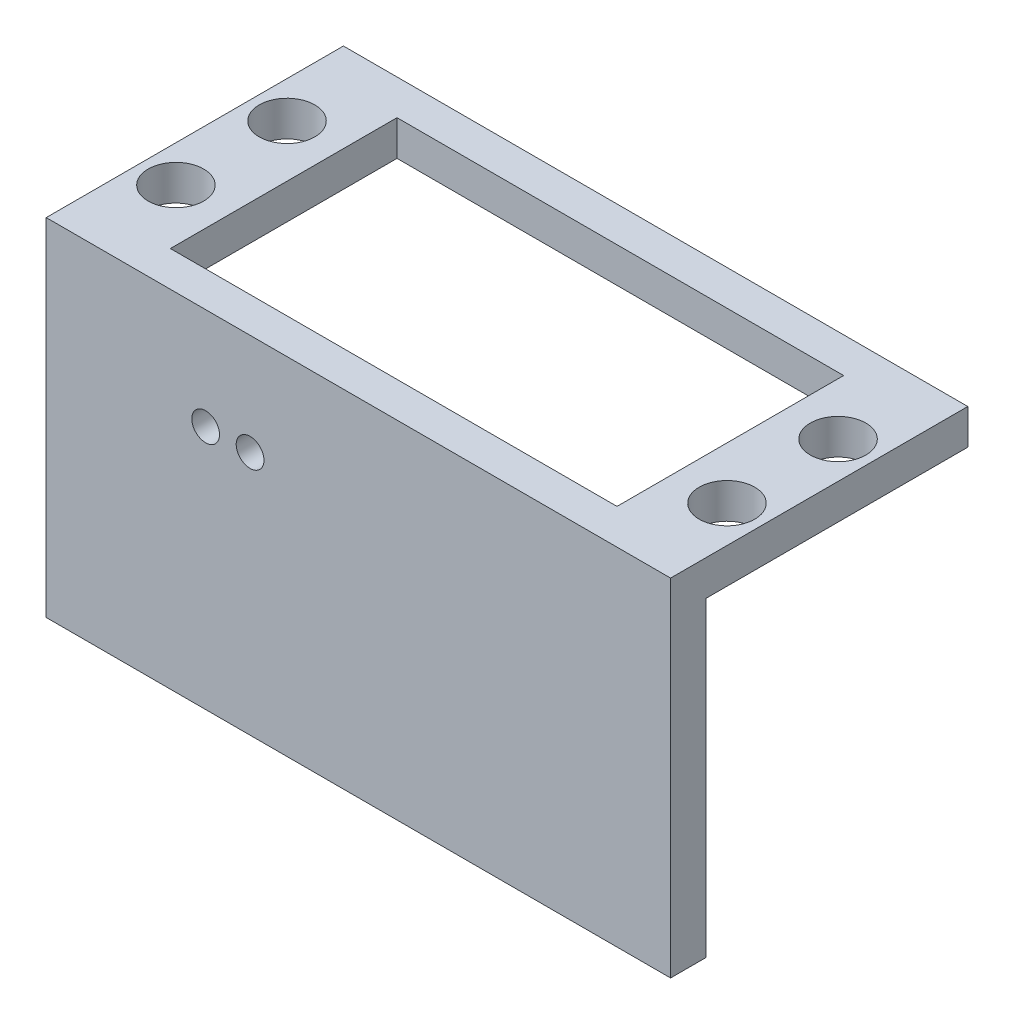
ISO-10303-21;
HEADER;
FILE_DESCRIPTION(('STEP AP214'),'2;1');
FILE_NAME('part.step','',(''),(''),'','','');
FILE_SCHEMA(('AUTOMOTIVE_DESIGN { 1 0 10303 214 1 1 1 1 }'));
ENDSEC;
DATA;
#1=APPLICATION_CONTEXT('core data for automotive mechanical design processes');
#2=APPLICATION_PROTOCOL_DEFINITION('international standard','automotive_design',2000,#1);
#3=PRODUCT_CONTEXT('',#1,'mechanical');
#4=PRODUCT('Part','Part','',(#3));
#5=PRODUCT_RELATED_PRODUCT_CATEGORY('part','',(#4));
#6=PRODUCT_DEFINITION_FORMATION('','',#4);
#7=PRODUCT_DEFINITION_CONTEXT('part definition',#1,'design');
#8=PRODUCT_DEFINITION('design','',#6,#7);
#9=PRODUCT_DEFINITION_SHAPE('','',#8);
#10=(LENGTH_UNIT() NAMED_UNIT(*) SI_UNIT(.MILLI.,.METRE.));
#11=(NAMED_UNIT(*) PLANE_ANGLE_UNIT() SI_UNIT($,.RADIAN.));
#12=(NAMED_UNIT(*) SI_UNIT($,.STERADIAN.) SOLID_ANGLE_UNIT());
#13=UNCERTAINTY_MEASURE_WITH_UNIT(LENGTH_MEASURE(1.E-05),#10,'distance_accuracy_value','');
#14=(GEOMETRIC_REPRESENTATION_CONTEXT(3) GLOBAL_UNCERTAINTY_ASSIGNED_CONTEXT((#13)) GLOBAL_UNIT_ASSIGNED_CONTEXT((#10,
#11,#12)) REPRESENTATION_CONTEXT('',''));
#15=CARTESIAN_POINT('',(0.,0.,0.));
#16=DIRECTION('',(0.,0.,1.));
#17=DIRECTION('',(1.,0.,0.));
#18=AXIS2_PLACEMENT_3D('',#15,#16,#17);
#19=CARTESIAN_POINT('',(0.,0.,0.));
#20=DIRECTION('',(0.,1.,0.));
#21=DIRECTION('',(0.,0.,1.));
#22=AXIS2_PLACEMENT_3D('',#19,#20,#21);
#23=PLANE('',#22);
#24=CARTESIAN_POINT('',(-24.8,0.,-4.99999999999998));
#25=DIRECTION('',(0.,1.,0.));
#26=DIRECTION('',(0.,0.,-1.));
#27=AXIS2_PLACEMENT_3D('',#24,#25,#26);
#28=CIRCLE('',#27,2.5);
#29=CARTESIAN_POINT('',(-24.8,0.,-7.49999999999998));
#30=VERTEX_POINT('',#29);
#31=EDGE_CURVE('E151',#30,#30,#28,.T.);
#32=ORIENTED_EDGE('',*,*,#31,.T.);
#33=EDGE_LOOP('',(#32));
#34=FACE_BOUND('',#33,.T.);
#35=CARTESIAN_POINT('',(-24.8,0.,5.00000000000002));
#36=DIRECTION('',(0.,1.,0.));
#37=DIRECTION('',(0.,0.,-1.));
#38=AXIS2_PLACEMENT_3D('',#35,#36,#37);
#39=CIRCLE('',#38,2.5);
#40=CARTESIAN_POINT('',(-24.8,0.,2.50000000000002));
#41=VERTEX_POINT('',#40);
#42=EDGE_CURVE('E155',#41,#41,#39,.T.);
#43=ORIENTED_EDGE('',*,*,#42,.T.);
#44=EDGE_LOOP('',(#43));
#45=FACE_BOUND('',#44,.T.);
#46=CARTESIAN_POINT('',(24.8,0.,5.00000000000001));
#47=DIRECTION('',(0.,1.,0.));
#48=DIRECTION('',(0.,0.,1.));
#49=AXIS2_PLACEMENT_3D('',#46,#47,#48);
#50=CIRCLE('',#49,2.5);
#51=CARTESIAN_POINT('',(24.8,0.,7.50000000000001));
#52=VERTEX_POINT('',#51);
#53=EDGE_CURVE('E161',#52,#52,#50,.T.);
#54=ORIENTED_EDGE('',*,*,#53,.T.);
#55=EDGE_LOOP('',(#54));
#56=FACE_BOUND('',#55,.T.);
#57=CARTESIAN_POINT('',(24.8,0.,-4.99999999999999));
#58=DIRECTION('',(0.,1.,0.));
#59=DIRECTION('',(0.,0.,1.));
#60=AXIS2_PLACEMENT_3D('',#57,#58,#59);
#61=CIRCLE('',#60,2.5);
#62=CARTESIAN_POINT('',(24.8,0.,-2.5));
#63=VERTEX_POINT('',#62);
#64=EDGE_CURVE('E167',#63,#63,#61,.T.);
#65=ORIENTED_EDGE('',*,*,#64,.T.);
#66=EDGE_LOOP('',(#65));
#67=FACE_BOUND('',#66,.T.);
#68=DIRECTION('',(1.,0.,0.));
#69=VECTOR('',#68,1.);
#70=CARTESIAN_POINT('',(28.1,0.,10.2));
#71=LINE('',#70,#69);
#72=CARTESIAN_POINT('',(-28.1,0.,10.2));
#73=VERTEX_POINT('',#72);
#74=CARTESIAN_POINT('',(-20.1,0.,10.2));
#75=VERTEX_POINT('',#74);
#76=EDGE_CURVE('E43',#73,#75,#71,.T.);
#77=ORIENTED_EDGE('',*,*,#76,.F.);
#78=DIRECTION('',(0.,0.,1.));
#79=VECTOR('',#78,1.);
#80=CARTESIAN_POINT('',(-28.1,0.,-13.375));
#81=LINE('',#80,#79);
#82=CARTESIAN_POINT('',(-28.1,0.,-13.375));
#83=VERTEX_POINT('',#82);
#84=EDGE_CURVE('E203',#83,#73,#81,.T.);
#85=ORIENTED_EDGE('',*,*,#84,.F.);
#86=DIRECTION('',(-1.,0.,0.));
#87=VECTOR('',#86,1.);
#88=CARTESIAN_POINT('',(-28.1,0.,-13.375));
#89=LINE('',#88,#87);
#90=CARTESIAN_POINT('',(28.1,0.,-13.375));
#91=VERTEX_POINT('',#90);
#92=EDGE_CURVE('E209',#91,#83,#89,.T.);
#93=ORIENTED_EDGE('',*,*,#92,.F.);
#94=DIRECTION('',(0.,0.,-1.));
#95=VECTOR('',#94,1.);
#96=CARTESIAN_POINT('',(28.1,0.,-13.375));
#97=LINE('',#96,#95);
#98=CARTESIAN_POINT('',(28.1,0.,10.2));
#99=VERTEX_POINT('',#98);
#100=EDGE_CURVE('E200',#99,#91,#97,.T.);
#101=ORIENTED_EDGE('',*,*,#100,.F.);
#102=CARTESIAN_POINT('',(20.1,0.,10.2));
#103=VERTEX_POINT('',#102);
#104=EDGE_CURVE('E11',#103,#99,#71,.T.);
#105=ORIENTED_EDGE('',*,*,#104,.F.);
#106=DIRECTION('',(0.,0.,-1.));
#107=VECTOR('',#106,1.);
#108=CARTESIAN_POINT('',(20.1,0.,-10.2));
#109=LINE('',#108,#107);
#110=CARTESIAN_POINT('',(20.1,0.,-10.2));
#111=VERTEX_POINT('',#110);
#112=EDGE_CURVE('E173',#103,#111,#109,.T.);
#113=ORIENTED_EDGE('',*,*,#112,.T.);
#114=DIRECTION('',(-1.,0.,0.));
#115=VECTOR('',#114,1.);
#116=CARTESIAN_POINT('',(-20.1,0.,-10.2));
#117=LINE('',#116,#115);
#118=CARTESIAN_POINT('',(-20.1,0.,-10.2));
#119=VERTEX_POINT('',#118);
#120=EDGE_CURVE('E188',#111,#119,#117,.T.);
#121=ORIENTED_EDGE('',*,*,#120,.T.);
#122=DIRECTION('',(0.,0.,1.));
#123=VECTOR('',#122,1.);
#124=CARTESIAN_POINT('',(-20.1,0.,-10.2));
#125=LINE('',#124,#123);
#126=EDGE_CURVE('E179',#119,#75,#125,.T.);
#127=ORIENTED_EDGE('',*,*,#126,.T.);
#128=EDGE_LOOP('',(#77,#85,#93,#101,#105,#113,#121,#127));
#129=FACE_BOUND('',#128,.T.);
#130=ADVANCED_FACE('F33',(#34,#45,#56,#67,#129),#23,.F.);
#131=CARTESIAN_POINT('',(0.,3.175,0.));
#132=DIRECTION('',(0.,1.,0.));
#133=DIRECTION('',(0.,0.,1.));
#134=AXIS2_PLACEMENT_3D('',#131,#132,#133);
#135=PLANE('',#134);
#136=CARTESIAN_POINT('',(-24.8,3.175,5.00000000000002));
#137=DIRECTION('',(0.,1.,0.));
#138=DIRECTION('',(0.,0.,-1.));
#139=AXIS2_PLACEMENT_3D('',#136,#137,#138);
#140=CIRCLE('',#139,2.5);
#141=CARTESIAN_POINT('',(-24.8,3.175,2.50000000000002));
#142=VERTEX_POINT('',#141);
#143=EDGE_CURVE('E158',#142,#142,#140,.T.);
#144=ORIENTED_EDGE('',*,*,#143,.F.);
#145=EDGE_LOOP('',(#144));
#146=FACE_BOUND('',#145,.T.);
#147=CARTESIAN_POINT('',(24.8,3.175,-4.99999999999999));
#148=DIRECTION('',(0.,1.,0.));
#149=DIRECTION('',(0.,0.,1.));
#150=AXIS2_PLACEMENT_3D('',#147,#148,#149);
#151=CIRCLE('',#150,2.5);
#152=CARTESIAN_POINT('',(24.8,3.175,-2.5));
#153=VERTEX_POINT('',#152);
#154=EDGE_CURVE('E170',#153,#153,#151,.T.);
#155=ORIENTED_EDGE('',*,*,#154,.F.);
#156=EDGE_LOOP('',(#155));
#157=FACE_BOUND('',#156,.T.);
#158=DIRECTION('',(0.,0.,-1.));
#159=VECTOR('',#158,1.);
#160=CARTESIAN_POINT('',(28.1,3.175,-13.375));
#161=LINE('',#160,#159);
#162=CARTESIAN_POINT('',(28.1,3.175,13.375));
#163=VERTEX_POINT('',#162);
#164=CARTESIAN_POINT('',(28.1,3.175,-13.375));
#165=VERTEX_POINT('',#164);
#166=EDGE_CURVE('E120',#163,#165,#161,.T.);
#167=ORIENTED_EDGE('',*,*,#166,.T.);
#168=DIRECTION('',(-1.,0.,0.));
#169=VECTOR('',#168,1.);
#170=CARTESIAN_POINT('',(-28.1,3.175,-13.375));
#171=LINE('',#170,#169);
#172=CARTESIAN_POINT('',(-28.1,3.175,-13.375));
#173=VERTEX_POINT('',#172);
#174=EDGE_CURVE('E202',#165,#173,#171,.T.);
#175=ORIENTED_EDGE('',*,*,#174,.T.);
#176=DIRECTION('',(0.,0.,1.));
#177=VECTOR('',#176,1.);
#178=CARTESIAN_POINT('',(-28.1,3.175,-13.375));
#179=LINE('',#178,#177);
#180=CARTESIAN_POINT('',(-28.1,3.175,13.375));
#181=VERTEX_POINT('',#180);
#182=EDGE_CURVE('E205',#173,#181,#179,.T.);
#183=ORIENTED_EDGE('',*,*,#182,.T.);
#184=DIRECTION('',(1.,0.,0.));
#185=VECTOR('',#184,1.);
#186=CARTESIAN_POINT('',(-28.1,3.175,13.375));
#187=LINE('',#186,#185);
#188=EDGE_CURVE('E124',#181,#163,#187,.T.);
#189=ORIENTED_EDGE('',*,*,#188,.T.);
#190=EDGE_LOOP('',(#167,#175,#183,#189));
#191=FACE_BOUND('',#190,.T.);
#192=DIRECTION('',(-1.,0.,0.));
#193=VECTOR('',#192,1.);
#194=CARTESIAN_POINT('',(-20.1,3.175,-10.2));
#195=LINE('',#194,#193);
#196=CARTESIAN_POINT('',(20.1,3.175,-10.2));
#197=VERTEX_POINT('',#196);
#198=CARTESIAN_POINT('',(-20.1,3.175,-10.2));
#199=VERTEX_POINT('',#198);
#200=EDGE_CURVE('E178',#197,#199,#195,.T.);
#201=ORIENTED_EDGE('',*,*,#200,.F.);
#202=DIRECTION('',(0.,0.,-1.));
#203=VECTOR('',#202,1.);
#204=CARTESIAN_POINT('',(20.1,3.175,-10.2));
#205=LINE('',#204,#203);
#206=CARTESIAN_POINT('',(20.1,3.175,10.2));
#207=VERTEX_POINT('',#206);
#208=EDGE_CURVE('E176',#207,#197,#205,.T.);
#209=ORIENTED_EDGE('',*,*,#208,.F.);
#210=DIRECTION('',(1.,0.,0.));
#211=VECTOR('',#210,1.);
#212=CARTESIAN_POINT('',(-20.1,3.175,10.2));
#213=LINE('',#212,#211);
#214=CARTESIAN_POINT('',(-20.1,3.175,10.2));
#215=VERTEX_POINT('',#214);
#216=EDGE_CURVE('E183',#215,#207,#213,.T.);
#217=ORIENTED_EDGE('',*,*,#216,.F.);
#218=DIRECTION('',(0.,0.,1.));
#219=VECTOR('',#218,1.);
#220=CARTESIAN_POINT('',(-20.1,3.175,-10.2));
#221=LINE('',#220,#219);
#222=EDGE_CURVE('E181',#199,#215,#221,.T.);
#223=ORIENTED_EDGE('',*,*,#222,.F.);
#224=EDGE_LOOP('',(#201,#209,#217,#223));
#225=FACE_BOUND('',#224,.T.);
#226=CARTESIAN_POINT('',(24.8,3.175,5.00000000000001));
#227=DIRECTION('',(0.,1.,0.));
#228=DIRECTION('',(0.,0.,1.));
#229=AXIS2_PLACEMENT_3D('',#226,#227,#228);
#230=CIRCLE('',#229,2.5);
#231=CARTESIAN_POINT('',(24.8,3.175,7.50000000000001));
#232=VERTEX_POINT('',#231);
#233=EDGE_CURVE('E164',#232,#232,#230,.T.);
#234=ORIENTED_EDGE('',*,*,#233,.F.);
#235=EDGE_LOOP('',(#234));
#236=FACE_BOUND('',#235,.T.);
#237=CARTESIAN_POINT('',(-24.8,3.175,-4.99999999999998));
#238=DIRECTION('',(0.,1.,0.));
#239=DIRECTION('',(0.,0.,-1.));
#240=AXIS2_PLACEMENT_3D('',#237,#238,#239);
#241=CIRCLE('',#240,2.5);
#242=CARTESIAN_POINT('',(-24.8,3.175,-7.49999999999998));
#243=VERTEX_POINT('',#242);
#244=EDGE_CURVE('E152',#243,#243,#241,.T.);
#245=ORIENTED_EDGE('',*,*,#244,.F.);
#246=EDGE_LOOP('',(#245));
#247=FACE_BOUND('',#246,.T.);
#248=ADVANCED_FACE('F236',(#146,#157,#191,#225,#236,#247),#135,.T.);
#249=CARTESIAN_POINT('',(28.1,3.175,-13.375));
#250=DIRECTION('',(-1.,0.,0.));
#251=DIRECTION('',(0.,0.,1.));
#252=AXIS2_PLACEMENT_3D('',#249,#250,#251);
#253=PLANE('',#252);
#254=DIRECTION('',(0.,-1.,0.));
#255=VECTOR('',#254,1.);
#256=CARTESIAN_POINT('',(28.1,3.175,13.375));
#257=LINE('',#256,#255);
#258=CARTESIAN_POINT('',(28.1,-28.,13.375));
#259=VERTEX_POINT('',#258);
#260=EDGE_CURVE('E113',#163,#259,#257,.T.);
#261=ORIENTED_EDGE('',*,*,#260,.T.);
#262=DIRECTION('',(0.,0.,1.));
#263=VECTOR('',#262,1.);
#264=CARTESIAN_POINT('',(28.1,-28.,13.375));
#265=LINE('',#264,#263);
#266=CARTESIAN_POINT('',(28.1,-28.,10.2));
#267=VERTEX_POINT('',#266);
#268=EDGE_CURVE('E117',#267,#259,#265,.T.);
#269=ORIENTED_EDGE('',*,*,#268,.F.);
#270=DIRECTION('',(0.,1.,0.));
#271=VECTOR('',#270,1.);
#272=CARTESIAN_POINT('',(28.1,-28.,10.2));
#273=LINE('',#272,#271);
#274=EDGE_CURVE('E145',#267,#99,#273,.T.);
#275=ORIENTED_EDGE('',*,*,#274,.T.);
#276=ORIENTED_EDGE('',*,*,#100,.T.);
#277=DIRECTION('',(0.,-1.,0.));
#278=VECTOR('',#277,1.);
#279=CARTESIAN_POINT('',(28.1,3.175,-13.375));
#280=LINE('',#279,#278);
#281=EDGE_CURVE('E37',#165,#91,#280,.T.);
#282=ORIENTED_EDGE('',*,*,#281,.F.);
#283=ORIENTED_EDGE('',*,*,#166,.F.);
#284=EDGE_LOOP('',(#261,#269,#275,#276,#282,#283));
#285=FACE_BOUND('',#284,.T.);
#286=ADVANCED_FACE('F35',(#285),#253,.F.);
#287=CARTESIAN_POINT('',(-28.1,3.175,-13.375));
#288=DIRECTION('',(0.,0.,1.));
#289=DIRECTION('',(1.,0.,0.));
#290=AXIS2_PLACEMENT_3D('',#287,#288,#289);
#291=PLANE('',#290);
#292=ORIENTED_EDGE('',*,*,#92,.T.);
#293=DIRECTION('',(0.,-1.,0.));
#294=VECTOR('',#293,1.);
#295=CARTESIAN_POINT('',(-28.1,3.175,-13.375));
#296=LINE('',#295,#294);
#297=EDGE_CURVE('E212',#173,#83,#296,.T.);
#298=ORIENTED_EDGE('',*,*,#297,.F.);
#299=ORIENTED_EDGE('',*,*,#174,.F.);
#300=ORIENTED_EDGE('',*,*,#281,.T.);
#301=EDGE_LOOP('',(#292,#298,#299,#300));
#302=FACE_BOUND('',#301,.T.);
#303=ADVANCED_FACE('F219',(#302),#291,.F.);
#304=CARTESIAN_POINT('',(-28.1,3.175,-13.375));
#305=DIRECTION('',(1.,0.,0.));
#306=DIRECTION('',(0.,0.,-1.));
#307=AXIS2_PLACEMENT_3D('',#304,#305,#306);
#308=PLANE('',#307);
#309=ORIENTED_EDGE('',*,*,#84,.T.);
#310=DIRECTION('',(0.,1.,0.));
#311=VECTOR('',#310,1.);
#312=CARTESIAN_POINT('',(-28.1,-28.,10.2));
#313=LINE('',#312,#311);
#314=CARTESIAN_POINT('',(-28.1,-28.,10.2));
#315=VERTEX_POINT('',#314);
#316=EDGE_CURVE('E148',#315,#73,#313,.T.);
#317=ORIENTED_EDGE('',*,*,#316,.F.);
#318=DIRECTION('',(0.,0.,-1.));
#319=VECTOR('',#318,1.);
#320=CARTESIAN_POINT('',(-28.1,-28.,13.375));
#321=LINE('',#320,#319);
#322=CARTESIAN_POINT('',(-28.1,-28.,13.375));
#323=VERTEX_POINT('',#322);
#324=EDGE_CURVE('E132',#323,#315,#321,.T.);
#325=ORIENTED_EDGE('',*,*,#324,.F.);
#326=DIRECTION('',(0.,-1.,0.));
#327=VECTOR('',#326,1.);
#328=CARTESIAN_POINT('',(-28.1,3.175,13.375));
#329=LINE('',#328,#327);
#330=EDGE_CURVE('E123',#181,#323,#329,.T.);
#331=ORIENTED_EDGE('',*,*,#330,.F.);
#332=ORIENTED_EDGE('',*,*,#182,.F.);
#333=ORIENTED_EDGE('',*,*,#297,.T.);
#334=EDGE_LOOP('',(#309,#317,#325,#331,#332,#333));
#335=FACE_BOUND('',#334,.T.);
#336=ADVANCED_FACE('F222',(#335),#308,.F.);
#337=CARTESIAN_POINT('',(-28.1,3.175,13.375));
#338=DIRECTION('',(0.,0.,-1.));
#339=DIRECTION('',(-1.,0.,0.));
#340=AXIS2_PLACEMENT_3D('',#337,#338,#339);
#341=PLANE('',#340);
#342=CARTESIAN_POINT('',(-9.75,-5.95332929377434,13.375));
#343=DIRECTION('',(0.,0.,1.));
#344=DIRECTION('',(1.,0.,0.));
#345=AXIS2_PLACEMENT_3D('',#342,#343,#344);
#346=CIRCLE('',#345,1.25);
#347=CARTESIAN_POINT('',(-8.5,-5.95332929377434,13.375));
#348=VERTEX_POINT('',#347);
#349=EDGE_CURVE('E398',#348,#348,#346,.T.);
#350=ORIENTED_EDGE('',*,*,#349,.F.);
#351=EDGE_LOOP('',(#350));
#352=FACE_BOUND('',#351,.T.);
#353=CARTESIAN_POINT('',(-13.75,-5.95332929377435,13.375));
#354=DIRECTION('',(0.,0.,1.));
#355=DIRECTION('',(1.,0.,0.));
#356=AXIS2_PLACEMENT_3D('',#353,#354,#355);
#357=CIRCLE('',#356,1.25);
#358=CARTESIAN_POINT('',(-12.5,-5.95332929377435,13.375));
#359=VERTEX_POINT('',#358);
#360=EDGE_CURVE('E403',#359,#359,#357,.T.);
#361=ORIENTED_EDGE('',*,*,#360,.F.);
#362=EDGE_LOOP('',(#361));
#363=FACE_BOUND('',#362,.T.);
#364=ORIENTED_EDGE('',*,*,#330,.T.);
#365=DIRECTION('',(-1.,0.,0.));
#366=VECTOR('',#365,1.);
#367=CARTESIAN_POINT('',(28.1,-28.,13.375));
#368=LINE('',#367,#366);
#369=EDGE_CURVE('E127',#259,#323,#368,.T.);
#370=ORIENTED_EDGE('',*,*,#369,.F.);
#371=ORIENTED_EDGE('',*,*,#260,.F.);
#372=ORIENTED_EDGE('',*,*,#188,.F.);
#373=EDGE_LOOP('',(#364,#370,#371,#372));
#374=FACE_BOUND('',#373,.T.);
#375=ADVANCED_FACE('F128',(#352,#363,#374),#341,.F.);
#376=CARTESIAN_POINT('',(20.1,3.175,-10.2));
#377=DIRECTION('',(-1.,0.,0.));
#378=DIRECTION('',(0.,0.,1.));
#379=AXIS2_PLACEMENT_3D('',#376,#377,#378);
#380=PLANE('',#379);
#381=ORIENTED_EDGE('',*,*,#112,.F.);
#382=DIRECTION('',(0.,-1.,0.));
#383=VECTOR('',#382,1.);
#384=CARTESIAN_POINT('',(20.1,3.175,10.2));
#385=LINE('',#384,#383);
#386=EDGE_CURVE('E185',#207,#103,#385,.T.);
#387=ORIENTED_EDGE('',*,*,#386,.F.);
#388=ORIENTED_EDGE('',*,*,#208,.T.);
#389=DIRECTION('',(0.,-1.,0.));
#390=VECTOR('',#389,1.);
#391=CARTESIAN_POINT('',(20.1,3.175,-10.2));
#392=LINE('',#391,#390);
#393=EDGE_CURVE('E197',#197,#111,#392,.T.);
#394=ORIENTED_EDGE('',*,*,#393,.T.);
#395=EDGE_LOOP('',(#381,#387,#388,#394));
#396=FACE_BOUND('',#395,.T.);
#397=ADVANCED_FACE('F227',(#396),#380,.T.);
#398=CARTESIAN_POINT('',(-20.1,3.175,-10.2));
#399=DIRECTION('',(0.,0.,1.));
#400=DIRECTION('',(1.,0.,0.));
#401=AXIS2_PLACEMENT_3D('',#398,#399,#400);
#402=PLANE('',#401);
#403=ORIENTED_EDGE('',*,*,#120,.F.);
#404=ORIENTED_EDGE('',*,*,#393,.F.);
#405=ORIENTED_EDGE('',*,*,#200,.T.);
#406=DIRECTION('',(0.,-1.,0.));
#407=VECTOR('',#406,1.);
#408=CARTESIAN_POINT('',(-20.1,3.175,-10.2));
#409=LINE('',#408,#407);
#410=EDGE_CURVE('E195',#199,#119,#409,.T.);
#411=ORIENTED_EDGE('',*,*,#410,.T.);
#412=EDGE_LOOP('',(#403,#404,#405,#411));
#413=FACE_BOUND('',#412,.T.);
#414=ADVANCED_FACE('F232',(#413),#402,.T.);
#415=CARTESIAN_POINT('',(-20.1,3.175,-10.2));
#416=DIRECTION('',(1.,0.,0.));
#417=DIRECTION('',(0.,0.,-1.));
#418=AXIS2_PLACEMENT_3D('',#415,#416,#417);
#419=PLANE('',#418);
#420=ORIENTED_EDGE('',*,*,#126,.F.);
#421=ORIENTED_EDGE('',*,*,#410,.F.);
#422=ORIENTED_EDGE('',*,*,#222,.T.);
#423=DIRECTION('',(0.,-1.,0.));
#424=VECTOR('',#423,1.);
#425=CARTESIAN_POINT('',(-20.1,3.175,10.2));
#426=LINE('',#425,#424);
#427=EDGE_CURVE('E56',#215,#75,#426,.T.);
#428=ORIENTED_EDGE('',*,*,#427,.T.);
#429=EDGE_LOOP('',(#420,#421,#422,#428));
#430=FACE_BOUND('',#429,.T.);
#431=ADVANCED_FACE('F241',(#430),#419,.T.);
#432=CARTESIAN_POINT('',(-20.1,3.175,10.2));
#433=DIRECTION('',(0.,0.,-1.));
#434=DIRECTION('',(-1.,0.,0.));
#435=AXIS2_PLACEMENT_3D('',#432,#433,#434);
#436=PLANE('',#435);
#437=CARTESIAN_POINT('',(-9.75,-5.95332929377434,10.2));
#438=DIRECTION('',(0.,0.,-1.));
#439=DIRECTION('',(-1.,0.,0.));
#440=AXIS2_PLACEMENT_3D('',#437,#438,#439);
#441=CIRCLE('',#440,1.25);
#442=CARTESIAN_POINT('',(-8.5,-5.95332929377434,10.2));
#443=VERTEX_POINT('',#442);
#444=EDGE_CURVE('E139',#443,#443,#441,.F.);
#445=ORIENTED_EDGE('',*,*,#444,.T.);
#446=EDGE_LOOP('',(#445));
#447=FACE_BOUND('',#446,.T.);
#448=CARTESIAN_POINT('',(-13.75,-5.95332929377435,10.2));
#449=DIRECTION('',(0.,0.,-1.));
#450=DIRECTION('',(-1.,0.,0.));
#451=AXIS2_PLACEMENT_3D('',#448,#449,#450);
#452=CIRCLE('',#451,1.25);
#453=CARTESIAN_POINT('',(-12.5,-5.95332929377435,10.2));
#454=VERTEX_POINT('',#453);
#455=EDGE_CURVE('E141',#454,#454,#452,.F.);
#456=ORIENTED_EDGE('',*,*,#455,.T.);
#457=EDGE_LOOP('',(#456));
#458=FACE_BOUND('',#457,.T.);
#459=ORIENTED_EDGE('',*,*,#386,.T.);
#460=ORIENTED_EDGE('',*,*,#104,.T.);
#461=ORIENTED_EDGE('',*,*,#274,.F.);
#462=DIRECTION('',(1.,0.,0.));
#463=VECTOR('',#462,1.);
#464=CARTESIAN_POINT('',(28.1,-28.,10.2));
#465=LINE('',#464,#463);
#466=EDGE_CURVE('E136',#315,#267,#465,.T.);
#467=ORIENTED_EDGE('',*,*,#466,.F.);
#468=ORIENTED_EDGE('',*,*,#316,.T.);
#469=ORIENTED_EDGE('',*,*,#76,.T.);
#470=ORIENTED_EDGE('',*,*,#427,.F.);
#471=ORIENTED_EDGE('',*,*,#216,.T.);
#472=EDGE_LOOP('',(#459,#460,#461,#467,#468,#469,#470,#471));
#473=FACE_BOUND('',#472,.T.);
#474=ADVANCED_FACE('F223',(#447,#458,#473),#436,.T.);
#475=CARTESIAN_POINT('',(24.8,3.175,-4.99999999999999));
#476=DIRECTION('',(0.,-1.,0.));
#477=DIRECTION('',(0.,0.,-1.));
#478=AXIS2_PLACEMENT_3D('',#475,#476,#477);
#479=CYLINDRICAL_SURFACE('',#478,2.5);
#480=ORIENTED_EDGE('',*,*,#154,.T.);
#481=EDGE_LOOP('',(#480));
#482=FACE_BOUND('',#481,.T.);
#483=ORIENTED_EDGE('',*,*,#64,.F.);
#484=EDGE_LOOP('',(#483));
#485=FACE_BOUND('',#484,.T.);
#486=ADVANCED_FACE('F248',(#482,#485),#479,.F.);
#487=CARTESIAN_POINT('',(24.8,3.175,5.00000000000001));
#488=DIRECTION('',(0.,-1.,0.));
#489=DIRECTION('',(0.,0.,-1.));
#490=AXIS2_PLACEMENT_3D('',#487,#488,#489);
#491=CYLINDRICAL_SURFACE('',#490,2.5);
#492=ORIENTED_EDGE('',*,*,#233,.T.);
#493=EDGE_LOOP('',(#492));
#494=FACE_BOUND('',#493,.T.);
#495=ORIENTED_EDGE('',*,*,#53,.F.);
#496=EDGE_LOOP('',(#495));
#497=FACE_BOUND('',#496,.T.);
#498=ADVANCED_FACE('F302',(#494,#497),#491,.F.);
#499=CARTESIAN_POINT('',(-24.8,3.175,5.00000000000002));
#500=DIRECTION('',(0.,-1.,0.));
#501=DIRECTION('',(0.,0.,-1.));
#502=AXIS2_PLACEMENT_3D('',#499,#500,#501);
#503=CYLINDRICAL_SURFACE('',#502,2.5);
#504=ORIENTED_EDGE('',*,*,#143,.T.);
#505=EDGE_LOOP('',(#504));
#506=FACE_BOUND('',#505,.T.);
#507=ORIENTED_EDGE('',*,*,#42,.F.);
#508=EDGE_LOOP('',(#507));
#509=FACE_BOUND('',#508,.T.);
#510=ADVANCED_FACE('F313',(#506,#509),#503,.F.);
#511=CARTESIAN_POINT('',(-24.8,3.175,-4.99999999999998));
#512=DIRECTION('',(0.,-1.,0.));
#513=DIRECTION('',(0.,0.,-1.));
#514=AXIS2_PLACEMENT_3D('',#511,#512,#513);
#515=CYLINDRICAL_SURFACE('',#514,2.5);
#516=ORIENTED_EDGE('',*,*,#244,.T.);
#517=EDGE_LOOP('',(#516));
#518=FACE_BOUND('',#517,.T.);
#519=ORIENTED_EDGE('',*,*,#31,.F.);
#520=EDGE_LOOP('',(#519));
#521=FACE_BOUND('',#520,.T.);
#522=ADVANCED_FACE('F323',(#518,#521),#515,.F.);
#523=CARTESIAN_POINT('',(0.,-28.,0.));
#524=DIRECTION('',(0.,1.,0.));
#525=DIRECTION('',(0.,0.,1.));
#526=AXIS2_PLACEMENT_3D('',#523,#524,#525);
#527=PLANE('',#526);
#528=ORIENTED_EDGE('',*,*,#268,.T.);
#529=ORIENTED_EDGE('',*,*,#369,.T.);
#530=ORIENTED_EDGE('',*,*,#324,.T.);
#531=ORIENTED_EDGE('',*,*,#466,.T.);
#532=EDGE_LOOP('',(#528,#529,#530,#531));
#533=FACE_BOUND('',#532,.T.);
#534=ADVANCED_FACE('F134',(#533),#527,.F.);
#535=CARTESIAN_POINT('',(-13.75,-5.95332929377435,6.66446609406726));
#536=DIRECTION('',(0.,0.,1.));
#537=DIRECTION('',(1.,0.,0.));
#538=AXIS2_PLACEMENT_3D('',#535,#536,#537);
#539=CYLINDRICAL_SURFACE('',#538,1.25);
#540=CARTESIAN_POINT('',(-12.5,-5.95332929377435,13.375));
#541=CARTESIAN_POINT('',(-12.5,-5.95332929377435,13.3419270833333));
#542=CARTESIAN_POINT('',(-12.5,-5.95332929377435,13.3088541666667));
#543=CARTESIAN_POINT('',(-12.5,-5.95332929377435,13.2427083333333));
#544=CARTESIAN_POINT('',(-12.5,-5.95332929377435,13.2096354166667));
#545=CARTESIAN_POINT('',(-12.5,-5.95332929377435,13.1434895833333));
#546=CARTESIAN_POINT('',(-12.5,-5.95332929377435,13.1104166666667));
#547=CARTESIAN_POINT('',(-12.5,-5.95332929377435,13.0442708333333));
#548=CARTESIAN_POINT('',(-12.5,-5.95332929377435,13.0111979166667));
#549=CARTESIAN_POINT('',(-12.5,-5.95332929377435,12.9450520833333));
#550=CARTESIAN_POINT('',(-12.5,-5.95332929377435,12.9119791666667));
#551=CARTESIAN_POINT('',(-12.5,-5.95332929377435,12.8458333333333));
#552=CARTESIAN_POINT('',(-12.5,-5.95332929377435,12.8127604166667));
#553=CARTESIAN_POINT('',(-12.5,-5.95332929377435,12.7466145833333));
#554=CARTESIAN_POINT('',(-12.5,-5.95332929377435,12.7135416666667));
#555=CARTESIAN_POINT('',(-12.5,-5.95332929377435,12.6473958333333));
#556=CARTESIAN_POINT('',(-12.5,-5.95332929377435,12.6143229166667));
#557=CARTESIAN_POINT('',(-12.5,-5.95332929377435,12.5481770833333));
#558=CARTESIAN_POINT('',(-12.5,-5.95332929377435,12.5151041666667));
#559=CARTESIAN_POINT('',(-12.5,-5.95332929377435,12.4489583333333));
#560=CARTESIAN_POINT('',(-12.5,-5.95332929377435,12.4158854166667));
#561=CARTESIAN_POINT('',(-12.5,-5.95332929377435,12.3497395833333));
#562=CARTESIAN_POINT('',(-12.5,-5.95332929377435,12.3166666666667));
#563=CARTESIAN_POINT('',(-12.5,-5.95332929377435,12.2505208333333));
#564=CARTESIAN_POINT('',(-12.5,-5.95332929377435,12.2174479166667));
#565=CARTESIAN_POINT('',(-12.5,-5.95332929377435,12.1513020833333));
#566=CARTESIAN_POINT('',(-12.5,-5.95332929377435,12.1182291666667));
#567=CARTESIAN_POINT('',(-12.5,-5.95332929377435,12.0520833333333));
#568=CARTESIAN_POINT('',(-12.5,-5.95332929377435,12.0190104166667));
#569=CARTESIAN_POINT('',(-12.5,-5.95332929377435,11.9528645833333));
#570=CARTESIAN_POINT('',(-12.5,-5.95332929377435,11.9197916666667));
#571=CARTESIAN_POINT('',(-12.5,-5.95332929377435,11.8536458333333));
#572=CARTESIAN_POINT('',(-12.5,-5.95332929377435,11.8205729166667));
#573=CARTESIAN_POINT('',(-12.5,-5.95332929377435,11.7544270833333));
#574=CARTESIAN_POINT('',(-12.5,-5.95332929377435,11.7213541666667));
#575=CARTESIAN_POINT('',(-12.5,-5.95332929377435,11.6552083333333));
#576=CARTESIAN_POINT('',(-12.5,-5.95332929377435,11.6221354166667));
#577=CARTESIAN_POINT('',(-12.5,-5.95332929377435,11.5559895833333));
#578=CARTESIAN_POINT('',(-12.5,-5.95332929377435,11.5229166666667));
#579=CARTESIAN_POINT('',(-12.5,-5.95332929377435,11.4567708333333));
#580=CARTESIAN_POINT('',(-12.5,-5.95332929377435,11.4236979166667));
#581=CARTESIAN_POINT('',(-12.5,-5.95332929377435,11.3575520833333));
#582=CARTESIAN_POINT('',(-12.5,-5.95332929377435,11.3244791666667));
#583=CARTESIAN_POINT('',(-12.5,-5.95332929377435,11.2583333333333));
#584=CARTESIAN_POINT('',(-12.5,-5.95332929377435,11.2252604166667));
#585=CARTESIAN_POINT('',(-12.5,-5.95332929377435,11.1591145833333));
#586=CARTESIAN_POINT('',(-12.5,-5.95332929377435,11.1260416666667));
#587=CARTESIAN_POINT('',(-12.5,-5.95332929377435,11.0598958333333));
#588=CARTESIAN_POINT('',(-12.5,-5.95332929377435,11.0268229166667));
#589=CARTESIAN_POINT('',(-12.5,-5.95332929377435,10.9606770833333));
#590=CARTESIAN_POINT('',(-12.5,-5.95332929377435,10.9276041666667));
#591=CARTESIAN_POINT('',(-12.5,-5.95332929377435,10.8614583333333));
#592=CARTESIAN_POINT('',(-12.5,-5.95332929377435,10.8283854166667));
#593=CARTESIAN_POINT('',(-12.5,-5.95332929377435,10.7622395833333));
#594=CARTESIAN_POINT('',(-12.5,-5.95332929377435,10.7291666666667));
#595=CARTESIAN_POINT('',(-12.5,-5.95332929377435,10.6630208333333));
#596=CARTESIAN_POINT('',(-12.5,-5.95332929377435,10.6299479166667));
#597=CARTESIAN_POINT('',(-12.5,-5.95332929377435,10.5638020833333));
#598=CARTESIAN_POINT('',(-12.5,-5.95332929377435,10.5307291666667));
#599=CARTESIAN_POINT('',(-12.5,-5.95332929377435,10.4645833333333));
#600=CARTESIAN_POINT('',(-12.5,-5.95332929377435,10.4315104166667));
#601=CARTESIAN_POINT('',(-12.5,-5.95332929377435,10.3653645833333));
#602=CARTESIAN_POINT('',(-12.5,-5.95332929377435,10.3322916666667));
#603=CARTESIAN_POINT('',(-12.5,-5.95332929377435,10.2661458333333));
#604=CARTESIAN_POINT('',(-12.5,-5.95332929377435,10.2330729166667));
#605=CARTESIAN_POINT('',(-12.5,-5.95332929377435,10.2));
#606=B_SPLINE_CURVE_WITH_KNOTS('',3,(#540,#541,#542,#543,#544,#545,#546,#547,#548,#549,#550,
#551,#552,#553,#554,#555,#556,#557,#558,#559,#560,#561,#562,#563,#564,#565,#566,#567,#568,#569,
#570,#571,#572,#573,#574,#575,#576,#577,#578,#579,#580,#581,#582,#583,#584,#585,#586,#587,#588,
#589,#590,#591,#592,#593,#594,#595,#596,#597,#598,#599,#600,#601,#602,#603,#604,#605),
.UNSPECIFIED.,.F.,.F.,(4,2,2,2,2,2,2,2,2,2,2,2,2,2,2,2,2,2,2,2,2,2,2,2,2,2,2,2,2,2,2,2,4),(0.,
0.0992187500000012,0.198437500000001,0.29765625,0.396875,0.496093749999999,0.5953125,
0.694531249999998,0.793749999999999,0.892968749999999,0.992187499999998,1.09140625,1.190625,
1.28984375,1.3890625,1.48828125,1.5875,1.68671875,1.7859375,1.88515625,1.984375,
2.08359374999999,2.1828125,2.28203124999999,2.38124999999999,2.48046875,2.57968749999999,
2.67890624999999,2.77812499999999,2.87734374999999,2.97656249999999,3.07578124999999,
3.17499999999999),.UNSPECIFIED.);
#607=EDGE_CURVE('BSEAM374',#359,#454,#606,.T.);
#608=ORIENTED_EDGE('',*,*,#360,.T.);
#609=ORIENTED_EDGE('',*,*,#455,.F.);
#610=ORIENTED_EDGE('',*,*,#607,.T.);
#611=ORIENTED_EDGE('',*,*,#607,.F.);
#612=EDGE_LOOP('',(#608,#610,#609,#611));
#613=FACE_BOUND('',#612,.T.);
#614=ADVANCED_FACE('F374',(#613),#539,.F.);
#615=CARTESIAN_POINT('',(-9.75,-5.95332929377434,6.66446609406726));
#616=DIRECTION('',(0.,0.,1.));
#617=DIRECTION('',(1.,0.,0.));
#618=AXIS2_PLACEMENT_3D('',#615,#616,#617);
#619=CYLINDRICAL_SURFACE('',#618,1.25);
#620=CARTESIAN_POINT('',(-8.5,-5.95332929377434,13.375));
#621=CARTESIAN_POINT('',(-8.5,-5.95332929377434,13.3419270833333));
#622=CARTESIAN_POINT('',(-8.5,-5.95332929377434,13.3088541666667));
#623=CARTESIAN_POINT('',(-8.5,-5.95332929377434,13.2427083333333));
#624=CARTESIAN_POINT('',(-8.5,-5.95332929377434,13.2096354166667));
#625=CARTESIAN_POINT('',(-8.5,-5.95332929377434,13.1434895833333));
#626=CARTESIAN_POINT('',(-8.5,-5.95332929377434,13.1104166666667));
#627=CARTESIAN_POINT('',(-8.5,-5.95332929377434,13.0442708333333));
#628=CARTESIAN_POINT('',(-8.5,-5.95332929377434,13.0111979166667));
#629=CARTESIAN_POINT('',(-8.5,-5.95332929377434,12.9450520833333));
#630=CARTESIAN_POINT('',(-8.5,-5.95332929377434,12.9119791666667));
#631=CARTESIAN_POINT('',(-8.5,-5.95332929377434,12.8458333333333));
#632=CARTESIAN_POINT('',(-8.5,-5.95332929377434,12.8127604166667));
#633=CARTESIAN_POINT('',(-8.5,-5.95332929377434,12.7466145833333));
#634=CARTESIAN_POINT('',(-8.5,-5.95332929377434,12.7135416666667));
#635=CARTESIAN_POINT('',(-8.5,-5.95332929377434,12.6473958333333));
#636=CARTESIAN_POINT('',(-8.5,-5.95332929377434,12.6143229166667));
#637=CARTESIAN_POINT('',(-8.5,-5.95332929377434,12.5481770833333));
#638=CARTESIAN_POINT('',(-8.5,-5.95332929377434,12.5151041666667));
#639=CARTESIAN_POINT('',(-8.5,-5.95332929377434,12.4489583333333));
#640=CARTESIAN_POINT('',(-8.5,-5.95332929377434,12.4158854166667));
#641=CARTESIAN_POINT('',(-8.5,-5.95332929377434,12.3497395833333));
#642=CARTESIAN_POINT('',(-8.5,-5.95332929377434,12.3166666666667));
#643=CARTESIAN_POINT('',(-8.5,-5.95332929377434,12.2505208333333));
#644=CARTESIAN_POINT('',(-8.5,-5.95332929377434,12.2174479166667));
#645=CARTESIAN_POINT('',(-8.5,-5.95332929377434,12.1513020833333));
#646=CARTESIAN_POINT('',(-8.5,-5.95332929377434,12.1182291666667));
#647=CARTESIAN_POINT('',(-8.5,-5.95332929377434,12.0520833333333));
#648=CARTESIAN_POINT('',(-8.5,-5.95332929377434,12.0190104166667));
#649=CARTESIAN_POINT('',(-8.5,-5.95332929377434,11.9528645833333));
#650=CARTESIAN_POINT('',(-8.5,-5.95332929377434,11.9197916666667));
#651=CARTESIAN_POINT('',(-8.5,-5.95332929377434,11.8536458333333));
#652=CARTESIAN_POINT('',(-8.5,-5.95332929377434,11.8205729166667));
#653=CARTESIAN_POINT('',(-8.5,-5.95332929377434,11.7544270833333));
#654=CARTESIAN_POINT('',(-8.5,-5.95332929377434,11.7213541666667));
#655=CARTESIAN_POINT('',(-8.5,-5.95332929377434,11.6552083333333));
#656=CARTESIAN_POINT('',(-8.5,-5.95332929377434,11.6221354166667));
#657=CARTESIAN_POINT('',(-8.5,-5.95332929377434,11.5559895833333));
#658=CARTESIAN_POINT('',(-8.5,-5.95332929377434,11.5229166666667));
#659=CARTESIAN_POINT('',(-8.5,-5.95332929377434,11.4567708333333));
#660=CARTESIAN_POINT('',(-8.5,-5.95332929377434,11.4236979166667));
#661=CARTESIAN_POINT('',(-8.5,-5.95332929377434,11.3575520833333));
#662=CARTESIAN_POINT('',(-8.5,-5.95332929377434,11.3244791666667));
#663=CARTESIAN_POINT('',(-8.5,-5.95332929377434,11.2583333333333));
#664=CARTESIAN_POINT('',(-8.5,-5.95332929377434,11.2252604166667));
#665=CARTESIAN_POINT('',(-8.5,-5.95332929377434,11.1591145833333));
#666=CARTESIAN_POINT('',(-8.5,-5.95332929377434,11.1260416666667));
#667=CARTESIAN_POINT('',(-8.5,-5.95332929377434,11.0598958333333));
#668=CARTESIAN_POINT('',(-8.5,-5.95332929377434,11.0268229166667));
#669=CARTESIAN_POINT('',(-8.5,-5.95332929377434,10.9606770833333));
#670=CARTESIAN_POINT('',(-8.5,-5.95332929377434,10.9276041666667));
#671=CARTESIAN_POINT('',(-8.5,-5.95332929377434,10.8614583333333));
#672=CARTESIAN_POINT('',(-8.5,-5.95332929377434,10.8283854166667));
#673=CARTESIAN_POINT('',(-8.5,-5.95332929377434,10.7622395833333));
#674=CARTESIAN_POINT('',(-8.5,-5.95332929377434,10.7291666666667));
#675=CARTESIAN_POINT('',(-8.5,-5.95332929377434,10.6630208333333));
#676=CARTESIAN_POINT('',(-8.5,-5.95332929377434,10.6299479166667));
#677=CARTESIAN_POINT('',(-8.5,-5.95332929377434,10.5638020833333));
#678=CARTESIAN_POINT('',(-8.5,-5.95332929377434,10.5307291666667));
#679=CARTESIAN_POINT('',(-8.5,-5.95332929377434,10.4645833333333));
#680=CARTESIAN_POINT('',(-8.5,-5.95332929377434,10.4315104166667));
#681=CARTESIAN_POINT('',(-8.5,-5.95332929377434,10.3653645833333));
#682=CARTESIAN_POINT('',(-8.5,-5.95332929377434,10.3322916666667));
#683=CARTESIAN_POINT('',(-8.5,-5.95332929377434,10.2661458333333));
#684=CARTESIAN_POINT('',(-8.5,-5.95332929377434,10.2330729166667));
#685=CARTESIAN_POINT('',(-8.5,-5.95332929377434,10.2));
#686=B_SPLINE_CURVE_WITH_KNOTS('',3,(#620,#621,#622,#623,#624,#625,#626,#627,#628,#629,#630,
#631,#632,#633,#634,#635,#636,#637,#638,#639,#640,#641,#642,#643,#644,#645,#646,#647,#648,#649,
#650,#651,#652,#653,#654,#655,#656,#657,#658,#659,#660,#661,#662,#663,#664,#665,#666,#667,#668,
#669,#670,#671,#672,#673,#674,#675,#676,#677,#678,#679,#680,#681,#682,#683,#684,#685),
.UNSPECIFIED.,.F.,.F.,(4,2,2,2,2,2,2,2,2,2,2,2,2,2,2,2,2,2,2,2,2,2,2,2,2,2,2,2,2,2,2,2,4),(0.,
0.0992187500000012,0.198437500000001,0.29765625,0.396875,0.496093749999999,0.5953125,
0.694531249999998,0.793749999999999,0.892968749999999,0.992187499999998,1.09140625,1.190625,
1.28984375,1.3890625,1.48828125,1.5875,1.68671875,1.7859375,1.88515625,1.984375,
2.08359374999999,2.1828125,2.28203124999999,2.38124999999999,2.48046875,2.57968749999999,
2.67890624999999,2.77812499999999,2.87734374999999,2.97656249999999,3.07578124999999,
3.17499999999999),.UNSPECIFIED.);
#687=EDGE_CURVE('BSEAM381',#348,#443,#686,.T.);
#688=ORIENTED_EDGE('',*,*,#349,.T.);
#689=ORIENTED_EDGE('',*,*,#444,.F.);
#690=ORIENTED_EDGE('',*,*,#687,.T.);
#691=ORIENTED_EDGE('',*,*,#687,.F.);
#692=EDGE_LOOP('',(#688,#690,#689,#691));
#693=FACE_BOUND('',#692,.T.);
#694=ADVANCED_FACE('F381',(#693),#619,.F.);
#695=CLOSED_SHELL('',(#130,#248,#286,#303,#336,#375,#397,#414,#431,#474,#486,#498,#510,#522,
#534,#614,#694));
#696=MANIFOLD_SOLID_BREP('B2',#695);
#697=ADVANCED_BREP_SHAPE_REPRESENTATION('',(#18,#696),#14);
#698=SHAPE_DEFINITION_REPRESENTATION(#9,#697);
ENDSEC;
END-ISO-10303-21;
